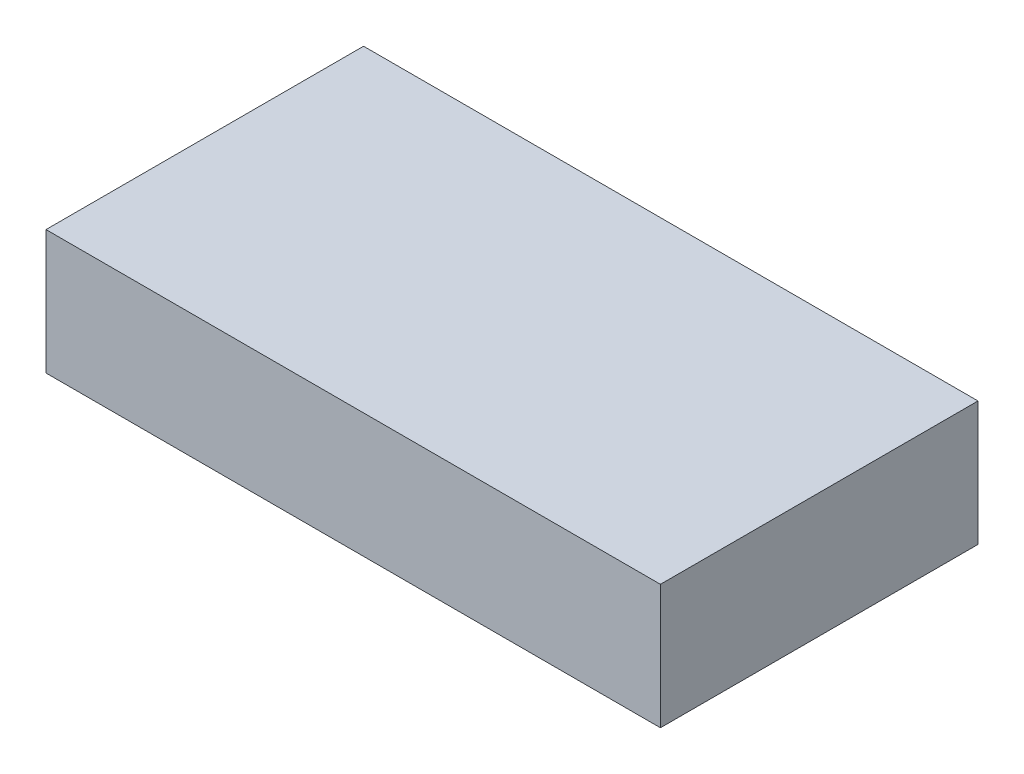
ISO-10303-21;
HEADER;
FILE_DESCRIPTION(('STEP AP214'),'2;1');
FILE_NAME('part.step','',(''),(''),'','','');
FILE_SCHEMA(('AUTOMOTIVE_DESIGN { 1 0 10303 214 1 1 1 1 }'));
ENDSEC;
DATA;
#1=APPLICATION_CONTEXT('core data for automotive mechanical design processes');
#2=APPLICATION_PROTOCOL_DEFINITION('international standard','automotive_design',2000,#1);
#3=PRODUCT_CONTEXT('',#1,'mechanical');
#4=PRODUCT('Part','Part','',(#3));
#5=PRODUCT_RELATED_PRODUCT_CATEGORY('part','',(#4));
#6=PRODUCT_DEFINITION_FORMATION('','',#4);
#7=PRODUCT_DEFINITION_CONTEXT('part definition',#1,'design');
#8=PRODUCT_DEFINITION('design','',#6,#7);
#9=PRODUCT_DEFINITION_SHAPE('','',#8);
#10=(LENGTH_UNIT() NAMED_UNIT(*) SI_UNIT(.MILLI.,.METRE.));
#11=(NAMED_UNIT(*) PLANE_ANGLE_UNIT() SI_UNIT($,.RADIAN.));
#12=(NAMED_UNIT(*) SI_UNIT($,.STERADIAN.) SOLID_ANGLE_UNIT());
#13=UNCERTAINTY_MEASURE_WITH_UNIT(LENGTH_MEASURE(1.E-05),#10,'distance_accuracy_value','');
#14=(GEOMETRIC_REPRESENTATION_CONTEXT(3) GLOBAL_UNCERTAINTY_ASSIGNED_CONTEXT((#13)) GLOBAL_UNIT_ASSIGNED_CONTEXT((#10,
#11,#12)) REPRESENTATION_CONTEXT('',''));
#15=CARTESIAN_POINT('',(0.,0.,0.));
#16=DIRECTION('',(0.,0.,1.));
#17=DIRECTION('',(1.,0.,0.));
#18=AXIS2_PLACEMENT_3D('',#15,#16,#17);
#19=CARTESIAN_POINT('',(-44.5,9.,23.));
#20=DIRECTION('',(1.,0.,0.));
#21=DIRECTION('',(0.,0.,-1.));
#22=AXIS2_PLACEMENT_3D('',#19,#20,#21);
#23=PLANE('',#22);
#24=DIRECTION('',(0.,0.,1.));
#25=VECTOR('',#24,1.);
#26=CARTESIAN_POINT('',(-44.5,-9.,23.));
#27=LINE('',#26,#25);
#28=CARTESIAN_POINT('',(-44.5,-9.,-23.));
#29=VERTEX_POINT('',#28);
#30=CARTESIAN_POINT('',(-44.5,-9.,23.));
#31=VERTEX_POINT('',#30);
#32=EDGE_CURVE('E95',#29,#31,#27,.T.);
#33=ORIENTED_EDGE('',*,*,#32,.T.);
#34=DIRECTION('',(0.,-1.,0.));
#35=VECTOR('',#34,1.);
#36=CARTESIAN_POINT('',(-44.5,9.,23.));
#37=LINE('',#36,#35);
#38=CARTESIAN_POINT('',(-44.5,9.,23.));
#39=VERTEX_POINT('',#38);
#40=EDGE_CURVE('E11',#39,#31,#37,.T.);
#41=ORIENTED_EDGE('',*,*,#40,.F.);
#42=DIRECTION('',(0.,0.,1.));
#43=VECTOR('',#42,1.);
#44=CARTESIAN_POINT('',(-44.5,9.,23.));
#45=LINE('',#44,#43);
#46=CARTESIAN_POINT('',(-44.5,9.,-23.));
#47=VERTEX_POINT('',#46);
#48=EDGE_CURVE('E83',#47,#39,#45,.T.);
#49=ORIENTED_EDGE('',*,*,#48,.F.);
#50=DIRECTION('',(0.,-1.,0.));
#51=VECTOR('',#50,1.);
#52=CARTESIAN_POINT('',(-44.5,9.,-23.));
#53=LINE('',#52,#51);
#54=EDGE_CURVE('E91',#47,#29,#53,.T.);
#55=ORIENTED_EDGE('',*,*,#54,.T.);
#56=EDGE_LOOP('',(#33,#41,#49,#55));
#57=FACE_BOUND('',#56,.T.);
#58=ADVANCED_FACE('F32',(#57),#23,.F.);
#59=CARTESIAN_POINT('',(44.5,9.,23.));
#60=DIRECTION('',(0.,0.,-1.));
#61=DIRECTION('',(-1.,0.,0.));
#62=AXIS2_PLACEMENT_3D('',#59,#60,#61);
#63=PLANE('',#62);
#64=DIRECTION('',(1.,0.,0.));
#65=VECTOR('',#64,1.);
#66=CARTESIAN_POINT('',(44.5,-9.,23.));
#67=LINE('',#66,#65);
#68=CARTESIAN_POINT('',(44.5,-9.,23.));
#69=VERTEX_POINT('',#68);
#70=EDGE_CURVE('E87',#31,#69,#67,.T.);
#71=ORIENTED_EDGE('',*,*,#70,.T.);
#72=DIRECTION('',(0.,-1.,0.));
#73=VECTOR('',#72,1.);
#74=CARTESIAN_POINT('',(44.5,9.,23.));
#75=LINE('',#74,#73);
#76=CARTESIAN_POINT('',(44.5,9.,23.));
#77=VERTEX_POINT('',#76);
#78=EDGE_CURVE('E40',#77,#69,#75,.T.);
#79=ORIENTED_EDGE('',*,*,#78,.F.);
#80=DIRECTION('',(1.,0.,0.));
#81=VECTOR('',#80,1.);
#82=CARTESIAN_POINT('',(44.5,9.,23.));
#83=LINE('',#82,#81);
#84=EDGE_CURVE('E78',#39,#77,#83,.T.);
#85=ORIENTED_EDGE('',*,*,#84,.F.);
#86=ORIENTED_EDGE('',*,*,#40,.T.);
#87=EDGE_LOOP('',(#71,#79,#85,#86));
#88=FACE_BOUND('',#87,.T.);
#89=ADVANCED_FACE('F86',(#88),#63,.F.);
#90=CARTESIAN_POINT('',(44.5,9.,23.));
#91=DIRECTION('',(-1.,0.,0.));
#92=DIRECTION('',(0.,0.,1.));
#93=AXIS2_PLACEMENT_3D('',#90,#91,#92);
#94=PLANE('',#93);
#95=DIRECTION('',(0.,0.,-1.));
#96=VECTOR('',#95,1.);
#97=CARTESIAN_POINT('',(44.5,-9.,23.));
#98=LINE('',#97,#96);
#99=CARTESIAN_POINT('',(44.5,-9.,-23.));
#100=VERTEX_POINT('',#99);
#101=EDGE_CURVE('E65',#69,#100,#98,.T.);
#102=ORIENTED_EDGE('',*,*,#101,.T.);
#103=DIRECTION('',(0.,-1.,0.));
#104=VECTOR('',#103,1.);
#105=CARTESIAN_POINT('',(44.5,9.,-23.));
#106=LINE('',#105,#104);
#107=CARTESIAN_POINT('',(44.5,9.,-23.));
#108=VERTEX_POINT('',#107);
#109=EDGE_CURVE('E88',#108,#100,#106,.T.);
#110=ORIENTED_EDGE('',*,*,#109,.F.);
#111=DIRECTION('',(0.,0.,-1.));
#112=VECTOR('',#111,1.);
#113=CARTESIAN_POINT('',(44.5,9.,23.));
#114=LINE('',#113,#112);
#115=EDGE_CURVE('E81',#77,#108,#114,.T.);
#116=ORIENTED_EDGE('',*,*,#115,.F.);
#117=ORIENTED_EDGE('',*,*,#78,.T.);
#118=EDGE_LOOP('',(#102,#110,#116,#117));
#119=FACE_BOUND('',#118,.T.);
#120=ADVANCED_FACE('F89',(#119),#94,.F.);
#121=CARTESIAN_POINT('',(44.5,9.,-23.));
#122=DIRECTION('',(0.,0.,1.));
#123=DIRECTION('',(1.,0.,0.));
#124=AXIS2_PLACEMENT_3D('',#121,#122,#123);
#125=PLANE('',#124);
#126=DIRECTION('',(-1.,0.,0.));
#127=VECTOR('',#126,1.);
#128=CARTESIAN_POINT('',(44.5,-9.,-23.));
#129=LINE('',#128,#127);
#130=EDGE_CURVE('E71',#100,#29,#129,.T.);
#131=ORIENTED_EDGE('',*,*,#130,.T.);
#132=ORIENTED_EDGE('',*,*,#54,.F.);
#133=DIRECTION('',(-1.,0.,0.));
#134=VECTOR('',#133,1.);
#135=CARTESIAN_POINT('',(44.5,9.,-23.));
#136=LINE('',#135,#134);
#137=EDGE_CURVE('E48',#108,#47,#136,.T.);
#138=ORIENTED_EDGE('',*,*,#137,.F.);
#139=ORIENTED_EDGE('',*,*,#109,.T.);
#140=EDGE_LOOP('',(#131,#132,#138,#139));
#141=FACE_BOUND('',#140,.T.);
#142=ADVANCED_FACE('F102',(#141),#125,.F.);
#143=CARTESIAN_POINT('',(0.,9.,0.));
#144=DIRECTION('',(0.,1.,0.));
#145=DIRECTION('',(0.,0.,1.));
#146=AXIS2_PLACEMENT_3D('',#143,#144,#145);
#147=PLANE('',#146);
#148=ORIENTED_EDGE('',*,*,#48,.T.);
#149=ORIENTED_EDGE('',*,*,#84,.T.);
#150=ORIENTED_EDGE('',*,*,#115,.T.);
#151=ORIENTED_EDGE('',*,*,#137,.T.);
#152=EDGE_LOOP('',(#148,#149,#150,#151));
#153=FACE_BOUND('',#152,.T.);
#154=ADVANCED_FACE('F79',(#153),#147,.T.);
#155=CARTESIAN_POINT('',(0.,-9.,0.));
#156=DIRECTION('',(0.,1.,0.));
#157=DIRECTION('',(0.,0.,1.));
#158=AXIS2_PLACEMENT_3D('',#155,#156,#157);
#159=PLANE('',#158);
#160=ORIENTED_EDGE('',*,*,#32,.F.);
#161=ORIENTED_EDGE('',*,*,#130,.F.);
#162=ORIENTED_EDGE('',*,*,#101,.F.);
#163=ORIENTED_EDGE('',*,*,#70,.F.);
#164=EDGE_LOOP('',(#160,#161,#162,#163));
#165=FACE_BOUND('',#164,.T.);
#166=ADVANCED_FACE('F105',(#165),#159,.F.);
#167=CLOSED_SHELL('',(#58,#89,#120,#142,#154,#166));
#168=MANIFOLD_SOLID_BREP('B2',#167);
#169=ADVANCED_BREP_SHAPE_REPRESENTATION('',(#18,#168),#14);
#170=SHAPE_DEFINITION_REPRESENTATION(#9,#169);
ENDSEC;
END-ISO-10303-21;
